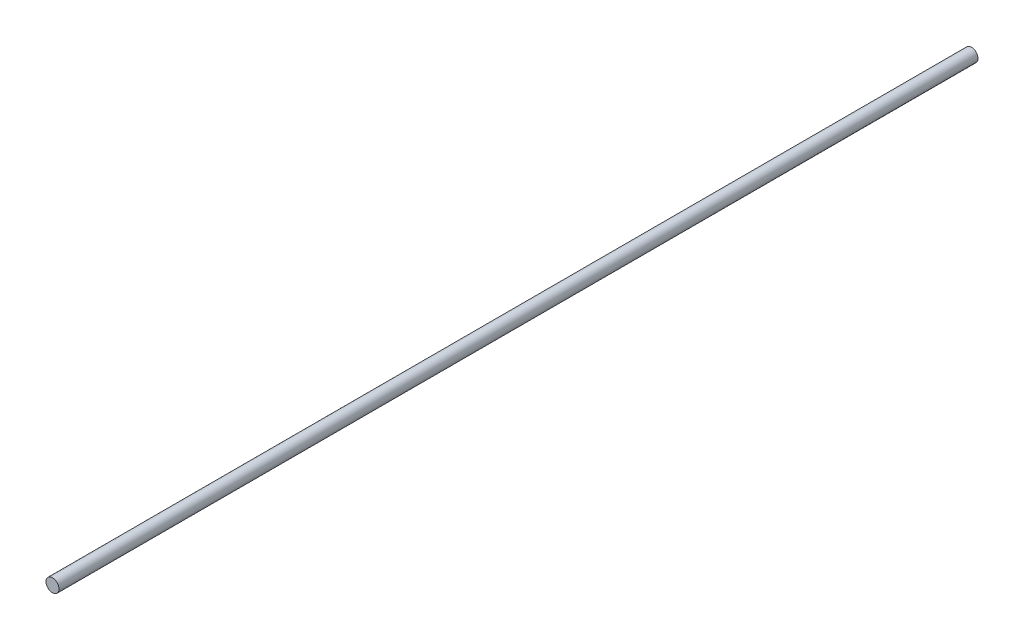
ISO-10303-21;
HEADER;
FILE_DESCRIPTION(('STEP AP214'),'2;1');
FILE_NAME('part.step','',(''),(''),'','','');
FILE_SCHEMA(('AUTOMOTIVE_DESIGN { 1 0 10303 214 1 1 1 1 }'));
ENDSEC;
DATA;
#1=APPLICATION_CONTEXT('core data for automotive mechanical design processes');
#2=APPLICATION_PROTOCOL_DEFINITION('international standard','automotive_design',2000,#1);
#3=PRODUCT_CONTEXT('',#1,'mechanical');
#4=PRODUCT('Part','Part','',(#3));
#5=PRODUCT_RELATED_PRODUCT_CATEGORY('part','',(#4));
#6=PRODUCT_DEFINITION_FORMATION('','',#4);
#7=PRODUCT_DEFINITION_CONTEXT('part definition',#1,'design');
#8=PRODUCT_DEFINITION('design','',#6,#7);
#9=PRODUCT_DEFINITION_SHAPE('','',#8);
#10=(LENGTH_UNIT() NAMED_UNIT(*) SI_UNIT(.MILLI.,.METRE.));
#11=(NAMED_UNIT(*) PLANE_ANGLE_UNIT() SI_UNIT($,.RADIAN.));
#12=(NAMED_UNIT(*) SI_UNIT($,.STERADIAN.) SOLID_ANGLE_UNIT());
#13=UNCERTAINTY_MEASURE_WITH_UNIT(LENGTH_MEASURE(1.E-05),#10,'distance_accuracy_value','');
#14=(GEOMETRIC_REPRESENTATION_CONTEXT(3) GLOBAL_UNCERTAINTY_ASSIGNED_CONTEXT((#13)) GLOBAL_UNIT_ASSIGNED_CONTEXT((#10,
#11,#12)) REPRESENTATION_CONTEXT('',''));
#15=CARTESIAN_POINT('',(0.,0.,0.));
#16=DIRECTION('',(0.,0.,1.));
#17=DIRECTION('',(1.,0.,0.));
#18=AXIS2_PLACEMENT_3D('',#15,#16,#17);
#19=CARTESIAN_POINT('',(0.,0.,897.135388694279));
#20=DIRECTION('',(0.,0.,-1.));
#21=DIRECTION('',(-1.,0.,0.));
#22=AXIS2_PLACEMENT_3D('',#19,#20,#21);
#23=CYLINDRICAL_SURFACE('',#22,6.35);
#24=CARTESIAN_POINT('',(0.,0.,897.135388694279));
#25=DIRECTION('',(0.,0.,1.));
#26=DIRECTION('',(1.,0.,0.));
#27=AXIS2_PLACEMENT_3D('',#24,#25,#26);
#28=CIRCLE('',#27,6.35);
#29=CARTESIAN_POINT('',(6.35,0.,897.135388694279));
#30=VERTEX_POINT('',#29);
#31=EDGE_CURVE('E10',#30,#30,#28,.T.);
#32=ORIENTED_EDGE('',*,*,#31,.F.);
#33=EDGE_LOOP('',(#32));
#34=FACE_BOUND('',#33,.T.);
#35=CARTESIAN_POINT('',(0.,0.,0.));
#36=DIRECTION('',(0.,0.,1.));
#37=DIRECTION('',(1.,0.,0.));
#38=AXIS2_PLACEMENT_3D('',#35,#36,#37);
#39=CIRCLE('',#38,6.35);
#40=CARTESIAN_POINT('',(6.35,0.,0.));
#41=VERTEX_POINT('',#40);
#42=EDGE_CURVE('E44',#41,#41,#39,.T.);
#43=ORIENTED_EDGE('',*,*,#42,.T.);
#44=EDGE_LOOP('',(#43));
#45=FACE_BOUND('',#44,.T.);
#46=ADVANCED_FACE('F41',(#34,#45),#23,.T.);
#47=CARTESIAN_POINT('',(0.,0.,897.135388694279));
#48=DIRECTION('',(0.,0.,1.));
#49=DIRECTION('',(1.,0.,0.));
#50=AXIS2_PLACEMENT_3D('',#47,#48,#49);
#51=PLANE('',#50);
#52=ORIENTED_EDGE('',*,*,#31,.T.);
#53=EDGE_LOOP('',(#52));
#54=FACE_BOUND('',#53,.T.);
#55=ADVANCED_FACE('F56',(#54),#51,.T.);
#56=CARTESIAN_POINT('',(0.,0.,0.));
#57=DIRECTION('',(0.,0.,1.));
#58=DIRECTION('',(1.,0.,0.));
#59=AXIS2_PLACEMENT_3D('',#56,#57,#58);
#60=PLANE('',#59);
#61=ORIENTED_EDGE('',*,*,#42,.F.);
#62=EDGE_LOOP('',(#61));
#63=FACE_BOUND('',#62,.T.);
#64=ADVANCED_FACE('F54',(#63),#60,.F.);
#65=CLOSED_SHELL('',(#46,#55,#64));
#66=MANIFOLD_SOLID_BREP('B2',#65);
#67=ADVANCED_BREP_SHAPE_REPRESENTATION('',(#18,#66),#14);
#68=SHAPE_DEFINITION_REPRESENTATION(#9,#67);
ENDSEC;
END-ISO-10303-21;
